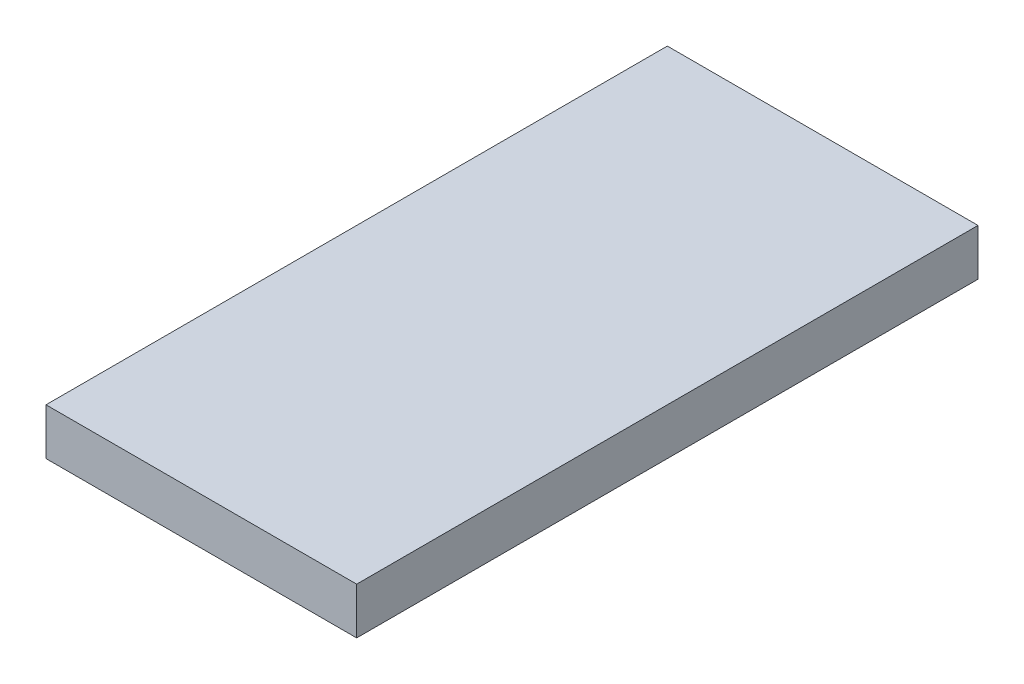
ISO-10303-21;
HEADER;
FILE_DESCRIPTION(('STEP AP214'),'2;1');
FILE_NAME('part.step','',(''),(''),'','','');
FILE_SCHEMA(('AUTOMOTIVE_DESIGN { 1 0 10303 214 1 1 1 1 }'));
ENDSEC;
DATA;
#1=APPLICATION_CONTEXT('core data for automotive mechanical design processes');
#2=APPLICATION_PROTOCOL_DEFINITION('international standard','automotive_design',2000,#1);
#3=PRODUCT_CONTEXT('',#1,'mechanical');
#4=PRODUCT('Part','Part','',(#3));
#5=PRODUCT_RELATED_PRODUCT_CATEGORY('part','',(#4));
#6=PRODUCT_DEFINITION_FORMATION('','',#4);
#7=PRODUCT_DEFINITION_CONTEXT('part definition',#1,'design');
#8=PRODUCT_DEFINITION('design','',#6,#7);
#9=PRODUCT_DEFINITION_SHAPE('','',#8);
#10=(LENGTH_UNIT() NAMED_UNIT(*) SI_UNIT(.MILLI.,.METRE.));
#11=(NAMED_UNIT(*) PLANE_ANGLE_UNIT() SI_UNIT($,.RADIAN.));
#12=(NAMED_UNIT(*) SI_UNIT($,.STERADIAN.) SOLID_ANGLE_UNIT());
#13=UNCERTAINTY_MEASURE_WITH_UNIT(LENGTH_MEASURE(1.E-05),#10,'distance_accuracy_value','');
#14=(GEOMETRIC_REPRESENTATION_CONTEXT(3) GLOBAL_UNCERTAINTY_ASSIGNED_CONTEXT((#13)) GLOBAL_UNIT_ASSIGNED_CONTEXT((#10,
#11,#12)) REPRESENTATION_CONTEXT('',''));
#15=CARTESIAN_POINT('',(0.,0.,0.));
#16=DIRECTION('',(0.,0.,1.));
#17=DIRECTION('',(1.,0.,0.));
#18=AXIS2_PLACEMENT_3D('',#15,#16,#17);
#19=CARTESIAN_POINT('',(-20.,0.,240.));
#20=DIRECTION('',(1.,0.,0.));
#21=DIRECTION('',(0.,0.,-1.));
#22=AXIS2_PLACEMENT_3D('',#19,#20,#21);
#23=PLANE('',#22);
#24=DIRECTION('',(0.,-1.,0.));
#25=VECTOR('',#24,1.);
#26=CARTESIAN_POINT('',(-20.,0.,160.));
#27=LINE('',#26,#25);
#28=CARTESIAN_POINT('',(-20.,6.,160.));
#29=VERTEX_POINT('',#28);
#30=CARTESIAN_POINT('',(-20.,0.,160.));
#31=VERTEX_POINT('',#30);
#32=EDGE_CURVE('E102',#29,#31,#27,.T.);
#33=ORIENTED_EDGE('',*,*,#32,.T.);
#34=DIRECTION('',(0.,0.,-1.));
#35=VECTOR('',#34,1.);
#36=CARTESIAN_POINT('',(-20.,0.,240.));
#37=LINE('',#36,#35);
#38=CARTESIAN_POINT('',(-20.,0.,240.));
#39=VERTEX_POINT('',#38);
#40=EDGE_CURVE('E11',#39,#31,#37,.T.);
#41=ORIENTED_EDGE('',*,*,#40,.F.);
#42=DIRECTION('',(0.,-1.,0.));
#43=VECTOR('',#42,1.);
#44=CARTESIAN_POINT('',(-20.,0.,240.));
#45=LINE('',#44,#43);
#46=CARTESIAN_POINT('',(-20.,6.,240.));
#47=VERTEX_POINT('',#46);
#48=EDGE_CURVE('E90',#47,#39,#45,.T.);
#49=ORIENTED_EDGE('',*,*,#48,.F.);
#50=DIRECTION('',(0.,0.,-1.));
#51=VECTOR('',#50,1.);
#52=CARTESIAN_POINT('',(-20.,6.,240.));
#53=LINE('',#52,#51);
#54=EDGE_CURVE('E98',#47,#29,#53,.T.);
#55=ORIENTED_EDGE('',*,*,#54,.T.);
#56=EDGE_LOOP('',(#33,#41,#49,#55));
#57=FACE_BOUND('',#56,.T.);
#58=ADVANCED_FACE('F39',(#57),#23,.F.);
#59=CARTESIAN_POINT('',(-20.,0.,240.));
#60=DIRECTION('',(0.,1.,0.));
#61=DIRECTION('',(0.,0.,1.));
#62=AXIS2_PLACEMENT_3D('',#59,#60,#61);
#63=PLANE('',#62);
#64=DIRECTION('',(1.,0.,0.));
#65=VECTOR('',#64,1.);
#66=CARTESIAN_POINT('',(-20.,0.,160.));
#67=LINE('',#66,#65);
#68=CARTESIAN_POINT('',(20.,0.,160.));
#69=VERTEX_POINT('',#68);
#70=EDGE_CURVE('E94',#31,#69,#67,.T.);
#71=ORIENTED_EDGE('',*,*,#70,.T.);
#72=DIRECTION('',(0.,0.,-1.));
#73=VECTOR('',#72,1.);
#74=CARTESIAN_POINT('',(20.,0.,240.));
#75=LINE('',#74,#73);
#76=CARTESIAN_POINT('',(20.,0.,240.));
#77=VERTEX_POINT('',#76);
#78=EDGE_CURVE('E47',#77,#69,#75,.T.);
#79=ORIENTED_EDGE('',*,*,#78,.F.);
#80=DIRECTION('',(1.,0.,0.));
#81=VECTOR('',#80,1.);
#82=CARTESIAN_POINT('',(-20.,0.,240.));
#83=LINE('',#82,#81);
#84=EDGE_CURVE('E85',#39,#77,#83,.T.);
#85=ORIENTED_EDGE('',*,*,#84,.F.);
#86=ORIENTED_EDGE('',*,*,#40,.T.);
#87=EDGE_LOOP('',(#71,#79,#85,#86));
#88=FACE_BOUND('',#87,.T.);
#89=ADVANCED_FACE('F93',(#88),#63,.F.);
#90=CARTESIAN_POINT('',(20.,0.,240.));
#91=DIRECTION('',(-1.,0.,0.));
#92=DIRECTION('',(0.,0.,1.));
#93=AXIS2_PLACEMENT_3D('',#90,#91,#92);
#94=PLANE('',#93);
#95=DIRECTION('',(0.,1.,0.));
#96=VECTOR('',#95,1.);
#97=CARTESIAN_POINT('',(20.,0.,160.));
#98=LINE('',#97,#96);
#99=CARTESIAN_POINT('',(20.,6.,160.));
#100=VERTEX_POINT('',#99);
#101=EDGE_CURVE('E72',#69,#100,#98,.T.);
#102=ORIENTED_EDGE('',*,*,#101,.T.);
#103=DIRECTION('',(0.,0.,-1.));
#104=VECTOR('',#103,1.);
#105=CARTESIAN_POINT('',(20.,6.,240.));
#106=LINE('',#105,#104);
#107=CARTESIAN_POINT('',(20.,6.,240.));
#108=VERTEX_POINT('',#107);
#109=EDGE_CURVE('E95',#108,#100,#106,.T.);
#110=ORIENTED_EDGE('',*,*,#109,.F.);
#111=DIRECTION('',(0.,1.,0.));
#112=VECTOR('',#111,1.);
#113=CARTESIAN_POINT('',(20.,0.,240.));
#114=LINE('',#113,#112);
#115=EDGE_CURVE('E88',#77,#108,#114,.T.);
#116=ORIENTED_EDGE('',*,*,#115,.F.);
#117=ORIENTED_EDGE('',*,*,#78,.T.);
#118=EDGE_LOOP('',(#102,#110,#116,#117));
#119=FACE_BOUND('',#118,.T.);
#120=ADVANCED_FACE('F96',(#119),#94,.F.);
#121=CARTESIAN_POINT('',(-20.,6.,240.));
#122=DIRECTION('',(0.,-1.,0.));
#123=DIRECTION('',(0.,0.,-1.));
#124=AXIS2_PLACEMENT_3D('',#121,#122,#123);
#125=PLANE('',#124);
#126=DIRECTION('',(-1.,0.,0.));
#127=VECTOR('',#126,1.);
#128=CARTESIAN_POINT('',(-20.,6.,160.));
#129=LINE('',#128,#127);
#130=EDGE_CURVE('E78',#100,#29,#129,.T.);
#131=ORIENTED_EDGE('',*,*,#130,.T.);
#132=ORIENTED_EDGE('',*,*,#54,.F.);
#133=DIRECTION('',(-1.,0.,0.));
#134=VECTOR('',#133,1.);
#135=CARTESIAN_POINT('',(-20.,6.,240.));
#136=LINE('',#135,#134);
#137=EDGE_CURVE('E55',#108,#47,#136,.T.);
#138=ORIENTED_EDGE('',*,*,#137,.F.);
#139=ORIENTED_EDGE('',*,*,#109,.T.);
#140=EDGE_LOOP('',(#131,#132,#138,#139));
#141=FACE_BOUND('',#140,.T.);
#142=ADVANCED_FACE('F109',(#141),#125,.F.);
#143=CARTESIAN_POINT('',(0.,0.,240.));
#144=DIRECTION('',(0.,0.,-1.));
#145=DIRECTION('',(-1.,0.,0.));
#146=AXIS2_PLACEMENT_3D('',#143,#144,#145);
#147=PLANE('',#146);
#148=ORIENTED_EDGE('',*,*,#48,.T.);
#149=ORIENTED_EDGE('',*,*,#84,.T.);
#150=ORIENTED_EDGE('',*,*,#115,.T.);
#151=ORIENTED_EDGE('',*,*,#137,.T.);
#152=EDGE_LOOP('',(#148,#149,#150,#151));
#153=FACE_BOUND('',#152,.T.);
#154=ADVANCED_FACE('F86',(#153),#147,.F.);
#155=CARTESIAN_POINT('',(0.,0.,160.));
#156=DIRECTION('',(0.,0.,-1.));
#157=DIRECTION('',(-1.,0.,0.));
#158=AXIS2_PLACEMENT_3D('',#155,#156,#157);
#159=PLANE('',#158);
#160=ORIENTED_EDGE('',*,*,#32,.F.);
#161=ORIENTED_EDGE('',*,*,#130,.F.);
#162=ORIENTED_EDGE('',*,*,#101,.F.);
#163=ORIENTED_EDGE('',*,*,#70,.F.);
#164=EDGE_LOOP('',(#160,#161,#162,#163));
#165=FACE_BOUND('',#164,.T.);
#166=ADVANCED_FACE('F112',(#165),#159,.T.);
#167=CLOSED_SHELL('',(#58,#89,#120,#142,#154,#166));
#168=MANIFOLD_SOLID_BREP('B2',#167);
#169=ADVANCED_BREP_SHAPE_REPRESENTATION('',(#18,#168),#14);
#170=SHAPE_DEFINITION_REPRESENTATION(#9,#169);
ENDSEC;
END-ISO-10303-21;
